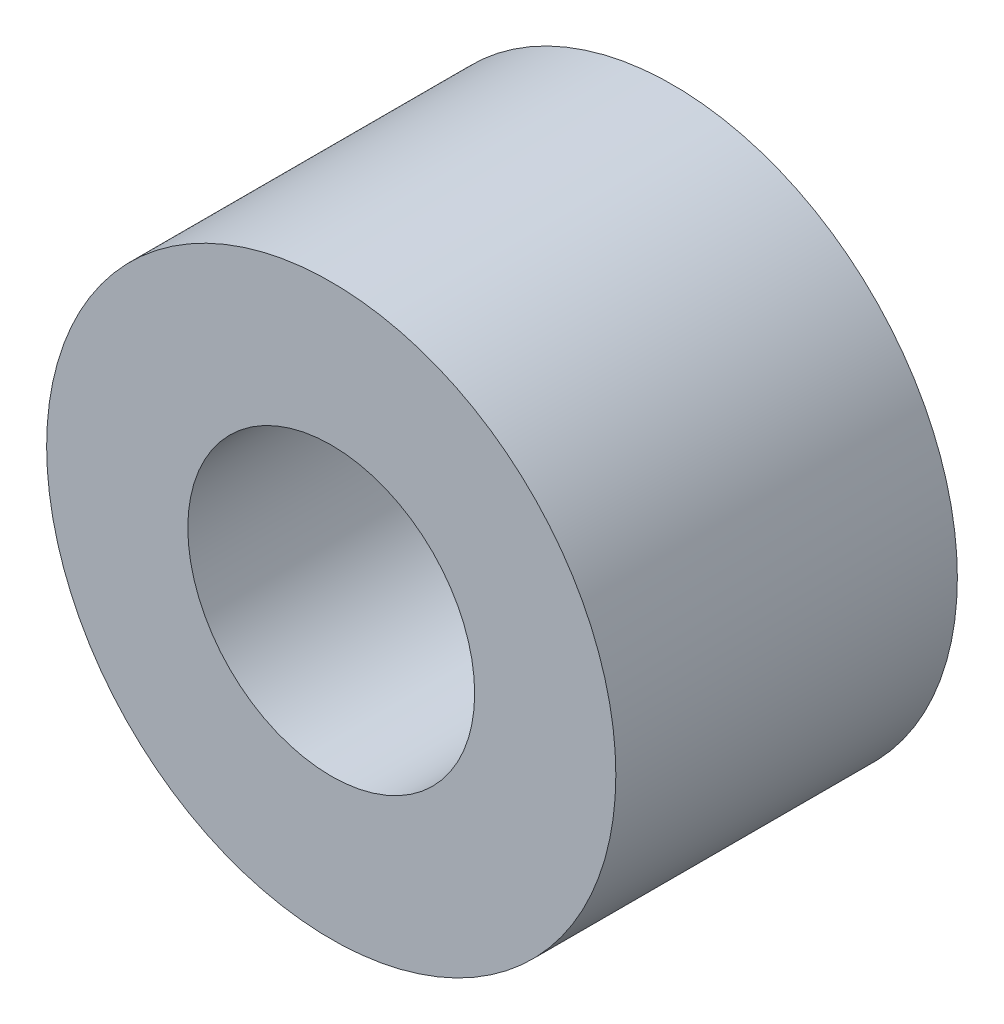
ISO-10303-21;
HEADER;
FILE_DESCRIPTION(('STEP AP214'),'2;1');
FILE_NAME('part.step','',(''),(''),'','','');
FILE_SCHEMA(('AUTOMOTIVE_DESIGN { 1 0 10303 214 1 1 1 1 }'));
ENDSEC;
DATA;
#1=APPLICATION_CONTEXT('core data for automotive mechanical design processes');
#2=APPLICATION_PROTOCOL_DEFINITION('international standard','automotive_design',2000,#1);
#3=PRODUCT_CONTEXT('',#1,'mechanical');
#4=PRODUCT('Part','Part','',(#3));
#5=PRODUCT_RELATED_PRODUCT_CATEGORY('part','',(#4));
#6=PRODUCT_DEFINITION_FORMATION('','',#4);
#7=PRODUCT_DEFINITION_CONTEXT('part definition',#1,'design');
#8=PRODUCT_DEFINITION('design','',#6,#7);
#9=PRODUCT_DEFINITION_SHAPE('','',#8);
#10=(LENGTH_UNIT() NAMED_UNIT(*) SI_UNIT(.MILLI.,.METRE.));
#11=(NAMED_UNIT(*) PLANE_ANGLE_UNIT() SI_UNIT($,.RADIAN.));
#12=(NAMED_UNIT(*) SI_UNIT($,.STERADIAN.) SOLID_ANGLE_UNIT());
#13=UNCERTAINTY_MEASURE_WITH_UNIT(LENGTH_MEASURE(1.E-05),#10,'distance_accuracy_value','');
#14=(GEOMETRIC_REPRESENTATION_CONTEXT(3) GLOBAL_UNCERTAINTY_ASSIGNED_CONTEXT((#13)) GLOBAL_UNIT_ASSIGNED_CONTEXT((#10,
#11,#12)) REPRESENTATION_CONTEXT('',''));
#15=CARTESIAN_POINT('',(0.,0.,0.));
#16=DIRECTION('',(0.,0.,1.));
#17=DIRECTION('',(1.,0.,0.));
#18=AXIS2_PLACEMENT_3D('',#15,#16,#17);
#19=CARTESIAN_POINT('',(0.,0.,9.525));
#20=DIRECTION('',(0.,0.,1.));
#21=DIRECTION('',(1.,0.,0.));
#22=AXIS2_PLACEMENT_3D('',#19,#20,#21);
#23=PLANE('',#22);
#24=CARTESIAN_POINT('',(0.,0.,9.525));
#25=DIRECTION('',(0.,0.,1.));
#26=DIRECTION('',(1.,0.,0.));
#27=AXIS2_PLACEMENT_3D('',#24,#25,#26);
#28=CIRCLE('',#27,7.9375);
#29=CARTESIAN_POINT('',(-7.9375,0.,9.525));
#30=VERTEX_POINT('',#29);
#31=EDGE_CURVE('E10',#30,#30,#28,.T.);
#32=ORIENTED_EDGE('',*,*,#31,.T.);
#33=EDGE_LOOP('',(#32));
#34=FACE_BOUND('',#33,.T.);
#35=CARTESIAN_POINT('',(0.,0.,9.525));
#36=DIRECTION('',(0.,0.,1.));
#37=DIRECTION('',(1.,0.,0.));
#38=AXIS2_PLACEMENT_3D('',#35,#36,#37);
#39=CIRCLE('',#38,4.);
#40=CARTESIAN_POINT('',(-4.,0.,9.525));
#41=VERTEX_POINT('',#40);
#42=EDGE_CURVE('E56',#41,#41,#39,.T.);
#43=ORIENTED_EDGE('',*,*,#42,.F.);
#44=EDGE_LOOP('',(#43));
#45=FACE_BOUND('',#44,.T.);
#46=ADVANCED_FACE('F43',(#34,#45),#23,.T.);
#47=CARTESIAN_POINT('',(0.,0.,0.));
#48=DIRECTION('',(0.,0.,1.));
#49=DIRECTION('',(1.,0.,0.));
#50=AXIS2_PLACEMENT_3D('',#47,#48,#49);
#51=PLANE('',#50);
#52=CARTESIAN_POINT('',(0.,0.,0.));
#53=DIRECTION('',(0.,0.,1.));
#54=DIRECTION('',(1.,0.,0.));
#55=AXIS2_PLACEMENT_3D('',#52,#53,#54);
#56=CIRCLE('',#55,7.9375);
#57=CARTESIAN_POINT('',(-7.9375,0.,0.));
#58=VERTEX_POINT('',#57);
#59=EDGE_CURVE('E47',#58,#58,#56,.T.);
#60=ORIENTED_EDGE('',*,*,#59,.F.);
#61=EDGE_LOOP('',(#60));
#62=FACE_BOUND('',#61,.T.);
#63=CARTESIAN_POINT('',(0.,0.,0.));
#64=DIRECTION('',(0.,0.,1.));
#65=DIRECTION('',(1.,0.,0.));
#66=AXIS2_PLACEMENT_3D('',#63,#64,#65);
#67=CIRCLE('',#66,4.);
#68=CARTESIAN_POINT('',(-4.,0.,0.));
#69=VERTEX_POINT('',#68);
#70=EDGE_CURVE('E58',#69,#69,#67,.T.);
#71=ORIENTED_EDGE('',*,*,#70,.T.);
#72=EDGE_LOOP('',(#71));
#73=FACE_BOUND('',#72,.T.);
#74=ADVANCED_FACE('F70',(#62,#73),#51,.F.);
#75=CARTESIAN_POINT('',(0.,0.,9.525));
#76=DIRECTION('',(0.,0.,-1.));
#77=DIRECTION('',(-1.,0.,0.));
#78=AXIS2_PLACEMENT_3D('',#75,#76,#77);
#79=CYLINDRICAL_SURFACE('',#78,7.9375);
#80=CARTESIAN_POINT('',(-7.9375,0.,9.525));
#81=CARTESIAN_POINT('',(-7.9375,0.,9.42578125));
#82=CARTESIAN_POINT('',(-7.9375,0.,9.3265625));
#83=CARTESIAN_POINT('',(-7.9375,0.,9.128125));
#84=CARTESIAN_POINT('',(-7.9375,0.,9.02890625));
#85=CARTESIAN_POINT('',(-7.9375,0.,8.83046875));
#86=CARTESIAN_POINT('',(-7.9375,0.,8.73125));
#87=CARTESIAN_POINT('',(-7.9375,0.,8.5328125));
#88=CARTESIAN_POINT('',(-7.9375,0.,8.43359375));
#89=CARTESIAN_POINT('',(-7.9375,0.,8.23515625));
#90=CARTESIAN_POINT('',(-7.9375,0.,8.1359375));
#91=CARTESIAN_POINT('',(-7.9375,0.,7.9375));
#92=CARTESIAN_POINT('',(-7.9375,0.,7.83828125));
#93=CARTESIAN_POINT('',(-7.9375,0.,7.63984375));
#94=CARTESIAN_POINT('',(-7.9375,0.,7.540625));
#95=CARTESIAN_POINT('',(-7.9375,0.,7.3421875));
#96=CARTESIAN_POINT('',(-7.9375,0.,7.24296875));
#97=CARTESIAN_POINT('',(-7.9375,0.,7.04453125));
#98=CARTESIAN_POINT('',(-7.9375,0.,6.9453125));
#99=CARTESIAN_POINT('',(-7.9375,0.,6.746875));
#100=CARTESIAN_POINT('',(-7.9375,0.,6.64765625));
#101=CARTESIAN_POINT('',(-7.9375,0.,6.44921875));
#102=CARTESIAN_POINT('',(-7.9375,0.,6.35));
#103=CARTESIAN_POINT('',(-7.9375,0.,6.1515625));
#104=CARTESIAN_POINT('',(-7.9375,0.,6.05234375));
#105=CARTESIAN_POINT('',(-7.9375,0.,5.85390625));
#106=CARTESIAN_POINT('',(-7.9375,0.,5.7546875));
#107=CARTESIAN_POINT('',(-7.9375,0.,5.55625));
#108=CARTESIAN_POINT('',(-7.9375,0.,5.45703125));
#109=CARTESIAN_POINT('',(-7.9375,0.,5.25859375));
#110=CARTESIAN_POINT('',(-7.9375,0.,5.159375));
#111=CARTESIAN_POINT('',(-7.9375,0.,4.9609375));
#112=CARTESIAN_POINT('',(-7.9375,0.,4.86171875));
#113=CARTESIAN_POINT('',(-7.9375,0.,4.66328125));
#114=CARTESIAN_POINT('',(-7.9375,0.,4.5640625));
#115=CARTESIAN_POINT('',(-7.9375,0.,4.365625));
#116=CARTESIAN_POINT('',(-7.9375,0.,4.26640625));
#117=CARTESIAN_POINT('',(-7.9375,0.,4.06796875));
#118=CARTESIAN_POINT('',(-7.9375,0.,3.96875));
#119=CARTESIAN_POINT('',(-7.9375,0.,3.7703125));
#120=CARTESIAN_POINT('',(-7.9375,0.,3.67109375));
#121=CARTESIAN_POINT('',(-7.9375,0.,3.47265625));
#122=CARTESIAN_POINT('',(-7.9375,0.,3.3734375));
#123=CARTESIAN_POINT('',(-7.9375,0.,3.175));
#124=CARTESIAN_POINT('',(-7.9375,0.,3.07578125));
#125=CARTESIAN_POINT('',(-7.9375,0.,2.87734375));
#126=CARTESIAN_POINT('',(-7.9375,0.,2.778125));
#127=CARTESIAN_POINT('',(-7.9375,0.,2.5796875));
#128=CARTESIAN_POINT('',(-7.9375,0.,2.48046875));
#129=CARTESIAN_POINT('',(-7.9375,0.,2.28203125));
#130=CARTESIAN_POINT('',(-7.9375,0.,2.1828125));
#131=CARTESIAN_POINT('',(-7.9375,0.,1.984375));
#132=CARTESIAN_POINT('',(-7.9375,0.,1.88515625));
#133=CARTESIAN_POINT('',(-7.9375,0.,1.68671875));
#134=CARTESIAN_POINT('',(-7.9375,0.,1.5875));
#135=CARTESIAN_POINT('',(-7.9375,0.,1.3890625));
#136=CARTESIAN_POINT('',(-7.9375,0.,1.28984375));
#137=CARTESIAN_POINT('',(-7.9375,0.,1.09140625));
#138=CARTESIAN_POINT('',(-7.9375,0.,0.992187500000001));
#139=CARTESIAN_POINT('',(-7.9375,0.,0.793750000000001));
#140=CARTESIAN_POINT('',(-7.9375,0.,0.69453125));
#141=CARTESIAN_POINT('',(-7.9375,0.,0.49609375));
#142=CARTESIAN_POINT('',(-7.9375,0.,0.396875));
#143=CARTESIAN_POINT('',(-7.9375,0.,0.1984375));
#144=CARTESIAN_POINT('',(-7.9375,0.,0.0992187500000001));
#145=CARTESIAN_POINT('',(-7.9375,0.,0.));
#146=B_SPLINE_CURVE_WITH_KNOTS('',3,(#80,#81,#82,#83,#84,#85,#86,#87,#88,#89,#90,#91,#92,#93,
#94,#95,#96,#97,#98,#99,#100,#101,#102,#103,#104,#105,#106,#107,#108,#109,#110,#111,#112,#113,
#114,#115,#116,#117,#118,#119,#120,#121,#122,#123,#124,#125,#126,#127,#128,#129,#130,#131,#132,
#133,#134,#135,#136,#137,#138,#139,#140,#141,#142,#143,#144,#145),.UNSPECIFIED.,.F.,.F.,(4,2,2,
2,2,2,2,2,2,2,2,2,2,2,2,2,2,2,2,2,2,2,2,2,2,2,2,2,2,2,2,2,4),(0.,0.297656249999998,
0.595312499999999,0.892968749999999,1.190625,1.48828125,1.7859375,2.08359375,2.38125,2.67890625,
2.9765625,3.27421875,3.571875,3.86953125,4.1671875,4.46484375,4.7625,5.06015625,5.3578125,
5.65546875,5.953125,6.25078125,6.5484375,6.84609375,7.14375,7.44140625,7.7390625,8.03671875,
8.334375,8.63203125,8.9296875,9.22734375,9.525),.UNSPECIFIED.);
#147=EDGE_CURVE('BSEAM45',#30,#58,#146,.T.);
#148=ORIENTED_EDGE('',*,*,#31,.F.);
#149=ORIENTED_EDGE('',*,*,#59,.T.);
#150=ORIENTED_EDGE('',*,*,#147,.T.);
#151=ORIENTED_EDGE('',*,*,#147,.F.);
#152=EDGE_LOOP('',(#148,#150,#149,#151));
#153=FACE_BOUND('',#152,.T.);
#154=ADVANCED_FACE('F45',(#153),#79,.T.);
#155=CARTESIAN_POINT('',(0.,0.,9.525));
#156=DIRECTION('',(0.,0.,-1.));
#157=DIRECTION('',(-1.,0.,0.));
#158=AXIS2_PLACEMENT_3D('',#155,#156,#157);
#159=CYLINDRICAL_SURFACE('',#158,4.);
#160=CARTESIAN_POINT('',(-4.,0.,9.525));
#161=CARTESIAN_POINT('',(-4.,0.,9.42578125));
#162=CARTESIAN_POINT('',(-4.,0.,9.3265625));
#163=CARTESIAN_POINT('',(-4.,0.,9.128125));
#164=CARTESIAN_POINT('',(-4.,0.,9.02890625));
#165=CARTESIAN_POINT('',(-4.,0.,8.83046875));
#166=CARTESIAN_POINT('',(-4.,0.,8.73125));
#167=CARTESIAN_POINT('',(-4.,0.,8.5328125));
#168=CARTESIAN_POINT('',(-4.,0.,8.43359375));
#169=CARTESIAN_POINT('',(-4.,0.,8.23515625));
#170=CARTESIAN_POINT('',(-4.,0.,8.1359375));
#171=CARTESIAN_POINT('',(-4.,0.,7.9375));
#172=CARTESIAN_POINT('',(-4.,0.,7.83828125));
#173=CARTESIAN_POINT('',(-4.,0.,7.63984375));
#174=CARTESIAN_POINT('',(-4.,0.,7.540625));
#175=CARTESIAN_POINT('',(-4.,0.,7.3421875));
#176=CARTESIAN_POINT('',(-4.,0.,7.24296875));
#177=CARTESIAN_POINT('',(-4.,0.,7.04453125));
#178=CARTESIAN_POINT('',(-4.,0.,6.9453125));
#179=CARTESIAN_POINT('',(-4.,0.,6.746875));
#180=CARTESIAN_POINT('',(-4.,0.,6.64765625));
#181=CARTESIAN_POINT('',(-4.,0.,6.44921875));
#182=CARTESIAN_POINT('',(-4.,0.,6.35));
#183=CARTESIAN_POINT('',(-4.,0.,6.1515625));
#184=CARTESIAN_POINT('',(-4.,0.,6.05234375));
#185=CARTESIAN_POINT('',(-4.,0.,5.85390625));
#186=CARTESIAN_POINT('',(-4.,0.,5.7546875));
#187=CARTESIAN_POINT('',(-4.,0.,5.55625));
#188=CARTESIAN_POINT('',(-4.,0.,5.45703125));
#189=CARTESIAN_POINT('',(-4.,0.,5.25859375));
#190=CARTESIAN_POINT('',(-4.,0.,5.159375));
#191=CARTESIAN_POINT('',(-4.,0.,4.9609375));
#192=CARTESIAN_POINT('',(-4.,0.,4.86171875));
#193=CARTESIAN_POINT('',(-4.,0.,4.66328125));
#194=CARTESIAN_POINT('',(-4.,0.,4.5640625));
#195=CARTESIAN_POINT('',(-4.,0.,4.365625));
#196=CARTESIAN_POINT('',(-4.,0.,4.26640625));
#197=CARTESIAN_POINT('',(-4.,0.,4.06796875));
#198=CARTESIAN_POINT('',(-4.,0.,3.96875));
#199=CARTESIAN_POINT('',(-4.,0.,3.7703125));
#200=CARTESIAN_POINT('',(-4.,0.,3.67109375));
#201=CARTESIAN_POINT('',(-4.,0.,3.47265625));
#202=CARTESIAN_POINT('',(-4.,0.,3.3734375));
#203=CARTESIAN_POINT('',(-4.,0.,3.175));
#204=CARTESIAN_POINT('',(-4.,0.,3.07578125));
#205=CARTESIAN_POINT('',(-4.,0.,2.87734375));
#206=CARTESIAN_POINT('',(-4.,0.,2.778125));
#207=CARTESIAN_POINT('',(-4.,0.,2.5796875));
#208=CARTESIAN_POINT('',(-4.,0.,2.48046875));
#209=CARTESIAN_POINT('',(-4.,0.,2.28203125));
#210=CARTESIAN_POINT('',(-4.,0.,2.1828125));
#211=CARTESIAN_POINT('',(-4.,0.,1.984375));
#212=CARTESIAN_POINT('',(-4.,0.,1.88515625));
#213=CARTESIAN_POINT('',(-4.,0.,1.68671875));
#214=CARTESIAN_POINT('',(-4.,0.,1.5875));
#215=CARTESIAN_POINT('',(-4.,0.,1.3890625));
#216=CARTESIAN_POINT('',(-4.,0.,1.28984375));
#217=CARTESIAN_POINT('',(-4.,0.,1.09140625));
#218=CARTESIAN_POINT('',(-4.,0.,0.992187500000001));
#219=CARTESIAN_POINT('',(-4.,0.,0.793750000000001));
#220=CARTESIAN_POINT('',(-4.,0.,0.69453125));
#221=CARTESIAN_POINT('',(-4.,0.,0.49609375));
#222=CARTESIAN_POINT('',(-4.,0.,0.396875));
#223=CARTESIAN_POINT('',(-4.,0.,0.1984375));
#224=CARTESIAN_POINT('',(-4.,0.,0.0992187500000001));
#225=CARTESIAN_POINT('',(-4.,0.,0.));
#226=B_SPLINE_CURVE_WITH_KNOTS('',3,(#160,#161,#162,#163,#164,#165,#166,#167,#168,#169,#170,
#171,#172,#173,#174,#175,#176,#177,#178,#179,#180,#181,#182,#183,#184,#185,#186,#187,#188,#189,
#190,#191,#192,#193,#194,#195,#196,#197,#198,#199,#200,#201,#202,#203,#204,#205,#206,#207,#208,
#209,#210,#211,#212,#213,#214,#215,#216,#217,#218,#219,#220,#221,#222,#223,#224,#225),
.UNSPECIFIED.,.F.,.F.,(4,2,2,2,2,2,2,2,2,2,2,2,2,2,2,2,2,2,2,2,2,2,2,2,2,2,2,2,2,2,2,2,4),(0.,
0.297656249999998,0.595312499999999,0.892968749999999,1.190625,1.48828125,1.7859375,2.08359375,
2.38125,2.67890625,2.9765625,3.27421875,3.571875,3.86953125,4.1671875,4.46484375,4.7625,
5.06015625,5.3578125,5.65546875,5.953125,6.25078125,6.5484375,6.84609375,7.14375,7.44140625,
7.7390625,8.03671875,8.334375,8.63203125,8.9296875,9.22734375,9.525),.UNSPECIFIED.);
#227=EDGE_CURVE('BSEAM66',#41,#69,#226,.T.);
#228=ORIENTED_EDGE('',*,*,#42,.T.);
#229=ORIENTED_EDGE('',*,*,#70,.F.);
#230=ORIENTED_EDGE('',*,*,#227,.T.);
#231=ORIENTED_EDGE('',*,*,#227,.F.);
#232=EDGE_LOOP('',(#228,#230,#229,#231));
#233=FACE_BOUND('',#232,.T.);
#234=ADVANCED_FACE('F66',(#233),#159,.F.);
#235=CLOSED_SHELL('',(#46,#74,#154,#234));
#236=MANIFOLD_SOLID_BREP('B2',#235);
#237=ADVANCED_BREP_SHAPE_REPRESENTATION('',(#18,#236),#14);
#238=SHAPE_DEFINITION_REPRESENTATION(#9,#237);
ENDSEC;
END-ISO-10303-21;
